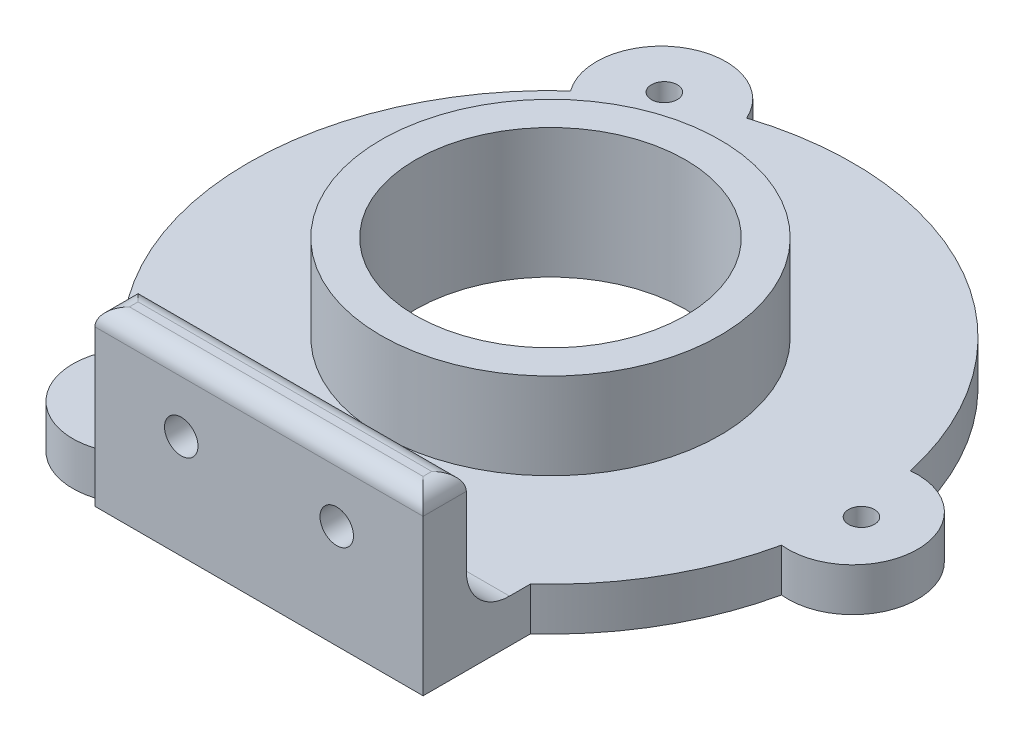
ISO-10303-21;
HEADER;
FILE_DESCRIPTION(('STEP AP214'),'2;1');
FILE_NAME('part.step','',(''),(''),'','','');
FILE_SCHEMA(('AUTOMOTIVE_DESIGN { 1 0 10303 214 1 1 1 1 }'));
ENDSEC;
DATA;
#1=APPLICATION_CONTEXT('core data for automotive mechanical design processes');
#2=APPLICATION_PROTOCOL_DEFINITION('international standard','automotive_design',2000,#1);
#3=PRODUCT_CONTEXT('',#1,'mechanical');
#4=PRODUCT('Part','Part','',(#3));
#5=PRODUCT_RELATED_PRODUCT_CATEGORY('part','',(#4));
#6=PRODUCT_DEFINITION_FORMATION('','',#4);
#7=PRODUCT_DEFINITION_CONTEXT('part definition',#1,'design');
#8=PRODUCT_DEFINITION('design','',#6,#7);
#9=PRODUCT_DEFINITION_SHAPE('','',#8);
#10=(LENGTH_UNIT() NAMED_UNIT(*) SI_UNIT(.MILLI.,.METRE.));
#11=(NAMED_UNIT(*) PLANE_ANGLE_UNIT() SI_UNIT($,.RADIAN.));
#12=(NAMED_UNIT(*) SI_UNIT($,.STERADIAN.) SOLID_ANGLE_UNIT());
#13=UNCERTAINTY_MEASURE_WITH_UNIT(LENGTH_MEASURE(1.E-05),#10,'distance_accuracy_value','');
#14=(GEOMETRIC_REPRESENTATION_CONTEXT(3) GLOBAL_UNCERTAINTY_ASSIGNED_CONTEXT((#13)) GLOBAL_UNIT_ASSIGNED_CONTEXT((#10,
#11,#12)) REPRESENTATION_CONTEXT('',''));
#15=CARTESIAN_POINT('',(0.,0.,0.));
#16=DIRECTION('',(0.,0.,1.));
#17=DIRECTION('',(1.,0.,0.));
#18=AXIS2_PLACEMENT_3D('',#15,#16,#17);
#19=CARTESIAN_POINT('',(0.,4.,0.));
#20=DIRECTION('',(0.,1.,0.));
#21=DIRECTION('',(0.,0.,1.));
#22=AXIS2_PLACEMENT_3D('',#19,#20,#21);
#23=PLANE('',#22);
#24=CARTESIAN_POINT('',(28.8,4.,0.));
#25=DIRECTION('',(0.,1.,0.));
#26=DIRECTION('',(0.,0.,1.));
#27=AXIS2_PLACEMENT_3D('',#24,#25,#26);
#28=CIRCLE('',#27,1.19737523071892);
#29=CARTESIAN_POINT('',(28.8,4.,1.19737523071892));
#30=VERTEX_POINT('',#29);
#31=EDGE_CURVE('E186',#30,#30,#28,.T.);
#32=ORIENTED_EDGE('',*,*,#31,.F.);
#33=EDGE_LOOP('',(#32));
#34=FACE_BOUND('',#33,.T.);
#35=CARTESIAN_POINT('',(-14.3999999999998,4.,-24.941531628992));
#36=DIRECTION('',(0.,1.,0.));
#37=DIRECTION('',(0.,0.,1.));
#38=AXIS2_PLACEMENT_3D('',#35,#36,#37);
#39=CIRCLE('',#38,1.19737523071892);
#40=CARTESIAN_POINT('',(-14.3999999999998,4.,-23.744156398273));
#41=VERTEX_POINT('',#40);
#42=EDGE_CURVE('E182',#41,#41,#39,.T.);
#43=ORIENTED_EDGE('',*,*,#42,.F.);
#44=EDGE_LOOP('',(#43));
#45=FACE_BOUND('',#44,.T.);
#46=CARTESIAN_POINT('',(-14.4000000000001,4.,24.9415316289918));
#47=DIRECTION('',(0.,1.,0.));
#48=DIRECTION('',(0.,0.,1.));
#49=AXIS2_PLACEMENT_3D('',#46,#47,#48);
#50=CIRCLE('',#49,1.19737523071892);
#51=CARTESIAN_POINT('',(-14.4000000000001,4.,26.1389068597107));
#52=VERTEX_POINT('',#51);
#53=EDGE_CURVE('E187',#52,#52,#50,.T.);
#54=ORIENTED_EDGE('',*,*,#53,.F.);
#55=EDGE_LOOP('',(#54));
#56=FACE_BOUND('',#55,.T.);
#57=CARTESIAN_POINT('',(0.,4.,0.));
#58=DIRECTION('',(0.,1.,0.));
#59=DIRECTION('',(0.,0.,1.));
#60=AXIS2_PLACEMENT_3D('',#57,#58,#59);
#61=CIRCLE('',#60,15.7);
#62=CARTESIAN_POINT('',(0.,4.,15.7));
#63=VERTEX_POINT('',#62);
#64=EDGE_CURVE('E173',#63,#63,#61,.T.);
#65=ORIENTED_EDGE('',*,*,#64,.F.);
#66=EDGE_LOOP('',(#65));
#67=FACE_BOUND('',#66,.T.);
#68=DIRECTION('',(0.,0.,1.));
#69=VECTOR('',#68,1.);
#70=CARTESIAN_POINT('',(-11.5500000000001,4.,30.6487113059642));
#71=LINE('',#70,#69);
#72=CARTESIAN_POINT('',(-11.5500000000001,4.,22.6487113059642));
#73=VERTEX_POINT('',#72);
#74=CARTESIAN_POINT('',(-11.5500000000001,4.,29.7257086585289));
#75=VERTEX_POINT('',#74);
#76=EDGE_CURVE('E272',#73,#75,#71,.T.);
#77=ORIENTED_EDGE('',*,*,#76,.F.);
#78=DIRECTION('',(-1.,0.,0.));
#79=VECTOR('',#78,1.);
#80=CARTESIAN_POINT('',(0.,4.,22.6487113059642));
#81=LINE('',#80,#79);
#82=CARTESIAN_POINT('',(18.8499999999999,4.,22.6487113059642));
#83=VERTEX_POINT('',#82);
#84=EDGE_CURVE('E242',#73,#83,#81,.F.);
#85=ORIENTED_EDGE('',*,*,#84,.T.);
#86=DIRECTION('',(0.,0.,-1.));
#87=VECTOR('',#86,1.);
#88=CARTESIAN_POINT('',(18.8499999999999,4.,20.2487113059642));
#89=LINE('',#88,#87);
#90=CARTESIAN_POINT('',(18.8499999999999,4.,20.7045284901638));
#91=VERTEX_POINT('',#90);
#92=EDGE_CURVE('E144',#83,#91,#89,.T.);
#93=ORIENTED_EDGE('',*,*,#92,.T.);
#94=CARTESIAN_POINT('',(0.,4.,0.));
#95=DIRECTION('',(0.,1.,0.));
#96=DIRECTION('',(0.,0.,1.));
#97=AXIS2_PLACEMENT_3D('',#94,#95,#96);
#98=CIRCLE('',#97,28.);
#99=CARTESIAN_POINT('',(27.3571428571429,4.,5.96546181731788));
#100=VERTEX_POINT('',#99);
#101=EDGE_CURVE('E233',#91,#100,#98,.T.);
#102=ORIENTED_EDGE('',*,*,#101,.T.);
#103=CARTESIAN_POINT('',(28.,4.,0.));
#104=DIRECTION('',(0.,1.,0.));
#105=DIRECTION('',(0.,0.,1.));
#106=AXIS2_PLACEMENT_3D('',#103,#104,#105);
#107=CIRCLE('',#106,6.);
#108=CARTESIAN_POINT('',(27.3571428571429,4.,-5.96546181731788));
#109=VERTEX_POINT('',#108);
#110=EDGE_CURVE('E218',#100,#109,#107,.T.);
#111=ORIENTED_EDGE('',*,*,#110,.T.);
#112=CARTESIAN_POINT('',(-8.51232994946781,4.,-26.6747115979047));
#113=VERTEX_POINT('',#112);
#114=EDGE_CURVE('E229',#109,#113,#98,.T.);
#115=ORIENTED_EDGE('',*,*,#114,.T.);
#116=CARTESIAN_POINT('',(-13.9999999999998,4.,-24.2487113059644));
#117=DIRECTION('',(0.,1.,0.));
#118=DIRECTION('',(0.,0.,1.));
#119=AXIS2_PLACEMENT_3D('',#116,#117,#118);
#120=CIRCLE('',#119,6.);
#121=CARTESIAN_POINT('',(-18.8448129076746,4.,-20.709249780587));
#122=VERTEX_POINT('',#121);
#123=EDGE_CURVE('E198',#113,#122,#120,.T.);
#124=ORIENTED_EDGE('',*,*,#123,.T.);
#125=CARTESIAN_POINT('',(-18.8448129076749,4.,20.7092497805867));
#126=VERTEX_POINT('',#125);
#127=EDGE_CURVE('E232',#122,#126,#98,.T.);
#128=ORIENTED_EDGE('',*,*,#127,.T.);
#129=CARTESIAN_POINT('',(-14.0000000000001,4.,24.2487113059642));
#130=DIRECTION('',(0.,1.,0.));
#131=DIRECTION('',(0.,0.,1.));
#132=AXIS2_PLACEMENT_3D('',#129,#130,#131);
#133=CIRCLE('',#132,6.);
#134=EDGE_CURVE('E210',#126,#75,#133,.T.);
#135=ORIENTED_EDGE('',*,*,#134,.T.);
#136=EDGE_LOOP('',(#77,#85,#93,#102,#111,#115,#124,#128,#135));
#137=FACE_BOUND('',#136,.T.);
#138=ADVANCED_FACE('F33',(#34,#45,#56,#67,#137),#23,.T.);
#139=CARTESIAN_POINT('',(0.,4.,0.));
#140=DIRECTION('',(0.,-1.,0.));
#141=DIRECTION('',(0.,0.,-1.));
#142=AXIS2_PLACEMENT_3D('',#139,#140,#141);
#143=CYLINDRICAL_SURFACE('',#142,28.);
#144=CARTESIAN_POINT('',(0.,0.,0.));
#145=DIRECTION('',(0.,1.,0.));
#146=DIRECTION('',(0.,0.,1.));
#147=AXIS2_PLACEMENT_3D('',#144,#145,#146);
#148=CIRCLE('',#147,28.);
#149=CARTESIAN_POINT('',(27.3571428571429,0.,-5.96546181731788));
#150=VERTEX_POINT('',#149);
#151=CARTESIAN_POINT('',(-8.51232994946781,0.,-26.6747115979047));
#152=VERTEX_POINT('',#151);
#153=EDGE_CURVE('E234',#150,#152,#148,.T.);
#154=ORIENTED_EDGE('',*,*,#153,.T.);
#155=DIRECTION('',(0.,1.,0.));
#156=VECTOR('',#155,1.);
#157=CARTESIAN_POINT('',(-8.51232994946781,2.,-26.6747115979047));
#158=LINE('',#157,#156);
#159=EDGE_CURVE('E207',#152,#113,#158,.T.);
#160=ORIENTED_EDGE('',*,*,#159,.T.);
#161=ORIENTED_EDGE('',*,*,#114,.F.);
#162=DIRECTION('',(0.,1.,0.));
#163=VECTOR('',#162,1.);
#164=CARTESIAN_POINT('',(27.3571428571429,2.,-5.96546181731788));
#165=LINE('',#164,#163);
#166=EDGE_CURVE('E221',#109,#150,#165,.F.);
#167=ORIENTED_EDGE('',*,*,#166,.T.);
#168=EDGE_LOOP('',(#154,#160,#161,#167));
#169=FACE_BOUND('',#168,.T.);
#170=ADVANCED_FACE('F328',(#169),#143,.T.);
#171=ORIENTED_EDGE('',*,*,#127,.F.);
#172=DIRECTION('',(0.,1.,0.));
#173=VECTOR('',#172,1.);
#174=CARTESIAN_POINT('',(-18.8448129076746,2.,-20.709249780587));
#175=LINE('',#174,#173);
#176=CARTESIAN_POINT('',(-18.8448129076746,0.,-20.709249780587));
#177=VERTEX_POINT('',#176);
#178=EDGE_CURVE('E203',#122,#177,#175,.F.);
#179=ORIENTED_EDGE('',*,*,#178,.T.);
#180=CARTESIAN_POINT('',(-18.8448129076749,0.,20.7092497805867));
#181=VERTEX_POINT('',#180);
#182=EDGE_CURVE('E237',#177,#181,#148,.T.);
#183=ORIENTED_EDGE('',*,*,#182,.T.);
#184=DIRECTION('',(0.,1.,0.));
#185=VECTOR('',#184,1.);
#186=CARTESIAN_POINT('',(-18.8448129076749,2.,20.7092497805867));
#187=LINE('',#186,#185);
#188=EDGE_CURVE('E213',#181,#126,#187,.T.);
#189=ORIENTED_EDGE('',*,*,#188,.T.);
#190=EDGE_LOOP('',(#171,#179,#183,#189));
#191=FACE_BOUND('',#190,.T.);
#192=ADVANCED_FACE('F336',(#191),#143,.T.);
#193=ORIENTED_EDGE('',*,*,#101,.F.);
#194=DIRECTION('',(0.,-1.,0.));
#195=VECTOR('',#194,1.);
#196=CARTESIAN_POINT('',(18.8499999999999,4.,20.7045284901638));
#197=LINE('',#196,#195);
#198=CARTESIAN_POINT('',(18.8499999999999,0.,20.7045284901638));
#199=VERTEX_POINT('',#198);
#200=EDGE_CURVE('E166',#91,#199,#197,.T.);
#201=ORIENTED_EDGE('',*,*,#200,.T.);
#202=CARTESIAN_POINT('',(27.3571428571429,0.,5.96546181731788));
#203=VERTEX_POINT('',#202);
#204=EDGE_CURVE('E228',#199,#203,#148,.T.);
#205=ORIENTED_EDGE('',*,*,#204,.T.);
#206=DIRECTION('',(0.,1.,0.));
#207=VECTOR('',#206,1.);
#208=CARTESIAN_POINT('',(27.3571428571429,2.,5.96546181731788));
#209=LINE('',#208,#207);
#210=EDGE_CURVE('E225',#203,#100,#209,.T.);
#211=ORIENTED_EDGE('',*,*,#210,.T.);
#212=EDGE_LOOP('',(#193,#201,#205,#211));
#213=FACE_BOUND('',#212,.T.);
#214=ADVANCED_FACE('F339',(#213),#143,.T.);
#215=CARTESIAN_POINT('',(0.,0.,0.));
#216=DIRECTION('',(0.,1.,0.));
#217=DIRECTION('',(0.,0.,1.));
#218=AXIS2_PLACEMENT_3D('',#215,#216,#217);
#219=PLANE('',#218);
#220=ORIENTED_EDGE('',*,*,#204,.F.);
#221=DIRECTION('',(0.,0.,-1.));
#222=VECTOR('',#221,1.);
#223=CARTESIAN_POINT('',(18.8499999999999,0.,20.2487113059642));
#224=LINE('',#223,#222);
#225=CARTESIAN_POINT('',(18.8499999999999,0.,30.6487113059642));
#226=VERTEX_POINT('',#225);
#227=EDGE_CURVE('E154',#226,#199,#224,.T.);
#228=ORIENTED_EDGE('',*,*,#227,.F.);
#229=DIRECTION('',(1.,0.,0.));
#230=VECTOR('',#229,1.);
#231=CARTESIAN_POINT('',(-11.5500000000001,0.,30.6487113059642));
#232=LINE('',#231,#230);
#233=CARTESIAN_POINT('',(-11.5500000000001,0.,30.6487113059642));
#234=VERTEX_POINT('',#233);
#235=EDGE_CURVE('E143',#234,#226,#232,.T.);
#236=ORIENTED_EDGE('',*,*,#235,.F.);
#237=DIRECTION('',(0.,0.,1.));
#238=VECTOR('',#237,1.);
#239=CARTESIAN_POINT('',(-11.5500000000001,0.,20.2487113059642));
#240=LINE('',#239,#238);
#241=CARTESIAN_POINT('',(-11.5500000000001,0.,29.7257086585289));
#242=VERTEX_POINT('',#241);
#243=EDGE_CURVE('E133',#242,#234,#240,.T.);
#244=ORIENTED_EDGE('',*,*,#243,.F.);
#245=CARTESIAN_POINT('',(-14.0000000000001,0.,24.2487113059642));
#246=DIRECTION('',(0.,1.,0.));
#247=DIRECTION('',(0.,0.,1.));
#248=AXIS2_PLACEMENT_3D('',#245,#246,#247);
#249=CIRCLE('',#248,6.);
#250=EDGE_CURVE('E211',#181,#242,#249,.T.);
#251=ORIENTED_EDGE('',*,*,#250,.F.);
#252=ORIENTED_EDGE('',*,*,#182,.F.);
#253=CARTESIAN_POINT('',(-13.9999999999998,0.,-24.2487113059644));
#254=DIRECTION('',(0.,1.,0.));
#255=DIRECTION('',(0.,0.,1.));
#256=AXIS2_PLACEMENT_3D('',#253,#254,#255);
#257=CIRCLE('',#256,6.);
#258=EDGE_CURVE('E201',#152,#177,#257,.T.);
#259=ORIENTED_EDGE('',*,*,#258,.F.);
#260=ORIENTED_EDGE('',*,*,#153,.F.);
#261=CARTESIAN_POINT('',(28.,0.,0.));
#262=DIRECTION('',(0.,1.,0.));
#263=DIRECTION('',(0.,0.,1.));
#264=AXIS2_PLACEMENT_3D('',#261,#262,#263);
#265=CIRCLE('',#264,6.);
#266=EDGE_CURVE('E219',#203,#150,#265,.T.);
#267=ORIENTED_EDGE('',*,*,#266,.F.);
#268=EDGE_LOOP('',(#220,#228,#236,#244,#251,#252,#259,#260,#267));
#269=FACE_BOUND('',#268,.T.);
#270=CARTESIAN_POINT('',(0.,0.,0.));
#271=DIRECTION('',(0.,1.,0.));
#272=DIRECTION('',(0.,0.,1.));
#273=AXIS2_PLACEMENT_3D('',#270,#271,#272);
#274=CIRCLE('',#273,12.5);
#275=CARTESIAN_POINT('',(0.,0.,12.5));
#276=VERTEX_POINT('',#275);
#277=EDGE_CURVE('E177',#276,#276,#274,.T.);
#278=ORIENTED_EDGE('',*,*,#277,.T.);
#279=EDGE_LOOP('',(#278));
#280=FACE_BOUND('',#279,.T.);
#281=CARTESIAN_POINT('',(-14.4000000000001,0.,24.9415316289918));
#282=DIRECTION('',(0.,1.,0.));
#283=DIRECTION('',(0.,0.,1.));
#284=AXIS2_PLACEMENT_3D('',#281,#282,#283);
#285=CIRCLE('',#284,1.19737523071892);
#286=CARTESIAN_POINT('',(-14.4000000000001,0.,26.1389068597107));
#287=VERTEX_POINT('',#286);
#288=EDGE_CURVE('E183',#287,#287,#285,.T.);
#289=ORIENTED_EDGE('',*,*,#288,.T.);
#290=EDGE_LOOP('',(#289));
#291=FACE_BOUND('',#290,.T.);
#292=CARTESIAN_POINT('',(-14.3999999999998,0.,-24.941531628992));
#293=DIRECTION('',(0.,1.,0.));
#294=DIRECTION('',(0.,0.,1.));
#295=AXIS2_PLACEMENT_3D('',#292,#293,#294);
#296=CIRCLE('',#295,1.19737523071892);
#297=CARTESIAN_POINT('',(-14.3999999999998,0.,-23.744156398273));
#298=VERTEX_POINT('',#297);
#299=EDGE_CURVE('E190',#298,#298,#296,.T.);
#300=ORIENTED_EDGE('',*,*,#299,.T.);
#301=EDGE_LOOP('',(#300));
#302=FACE_BOUND('',#301,.T.);
#303=CARTESIAN_POINT('',(28.8,0.,0.));
#304=DIRECTION('',(0.,1.,0.));
#305=DIRECTION('',(0.,0.,1.));
#306=AXIS2_PLACEMENT_3D('',#303,#304,#305);
#307=CIRCLE('',#306,1.19737523071892);
#308=CARTESIAN_POINT('',(28.8,0.,1.19737523071892));
#309=VERTEX_POINT('',#308);
#310=EDGE_CURVE('E195',#309,#309,#307,.T.);
#311=ORIENTED_EDGE('',*,*,#310,.T.);
#312=EDGE_LOOP('',(#311));
#313=FACE_BOUND('',#312,.T.);
#314=ADVANCED_FACE('F158',(#269,#280,#291,#302,#313),#219,.F.);
#315=CARTESIAN_POINT('',(28.,0.,0.));
#316=DIRECTION('',(0.,1.,0.));
#317=DIRECTION('',(0.,0.,1.));
#318=AXIS2_PLACEMENT_3D('',#315,#316,#317);
#319=CYLINDRICAL_SURFACE('',#318,6.);
#320=ORIENTED_EDGE('',*,*,#210,.F.);
#321=ORIENTED_EDGE('',*,*,#266,.T.);
#322=ORIENTED_EDGE('',*,*,#166,.F.);
#323=ORIENTED_EDGE('',*,*,#110,.F.);
#324=EDGE_LOOP('',(#320,#321,#322,#323));
#325=FACE_BOUND('',#324,.T.);
#326=ADVANCED_FACE('F344',(#325),#319,.T.);
#327=CARTESIAN_POINT('',(-14.0000000000001,0.,24.2487113059642));
#328=DIRECTION('',(0.,1.,0.));
#329=DIRECTION('',(0.,0.,1.));
#330=AXIS2_PLACEMENT_3D('',#327,#328,#329);
#331=CYLINDRICAL_SURFACE('',#330,6.);
#332=DIRECTION('',(0.,1.,0.));
#333=VECTOR('',#332,1.);
#334=CARTESIAN_POINT('',(-11.5500000000001,0.,29.7257086585289));
#335=LINE('',#334,#333);
#336=EDGE_CURVE('E138',#75,#242,#335,.F.);
#337=ORIENTED_EDGE('',*,*,#336,.F.);
#338=ORIENTED_EDGE('',*,*,#134,.F.);
#339=ORIENTED_EDGE('',*,*,#188,.F.);
#340=ORIENTED_EDGE('',*,*,#250,.T.);
#341=EDGE_LOOP('',(#337,#338,#339,#340));
#342=FACE_BOUND('',#341,.T.);
#343=ADVANCED_FACE('F394',(#342),#331,.T.);
#344=CARTESIAN_POINT('',(-13.9999999999998,0.,-24.2487113059644));
#345=DIRECTION('',(0.,1.,0.));
#346=DIRECTION('',(0.,0.,1.));
#347=AXIS2_PLACEMENT_3D('',#344,#345,#346);
#348=CYLINDRICAL_SURFACE('',#347,6.);
#349=ORIENTED_EDGE('',*,*,#159,.F.);
#350=ORIENTED_EDGE('',*,*,#258,.T.);
#351=ORIENTED_EDGE('',*,*,#178,.F.);
#352=ORIENTED_EDGE('',*,*,#123,.F.);
#353=EDGE_LOOP('',(#349,#350,#351,#352));
#354=FACE_BOUND('',#353,.T.);
#355=ADVANCED_FACE('F391',(#354),#348,.T.);
#356=CARTESIAN_POINT('',(28.8,0.,0.));
#357=DIRECTION('',(0.,1.,0.));
#358=DIRECTION('',(0.,0.,1.));
#359=AXIS2_PLACEMENT_3D('',#356,#357,#358);
#360=CYLINDRICAL_SURFACE('',#359,1.19737523071892);
#361=ORIENTED_EDGE('',*,*,#310,.F.);
#362=EDGE_LOOP('',(#361));
#363=FACE_BOUND('',#362,.T.);
#364=ORIENTED_EDGE('',*,*,#31,.T.);
#365=EDGE_LOOP('',(#364));
#366=FACE_BOUND('',#365,.T.);
#367=ADVANCED_FACE('F387',(#363,#366),#360,.F.);
#368=CARTESIAN_POINT('',(-14.3999999999998,0.,-24.941531628992));
#369=DIRECTION('',(0.,1.,0.));
#370=DIRECTION('',(0.,0.,1.));
#371=AXIS2_PLACEMENT_3D('',#368,#369,#370);
#372=CYLINDRICAL_SURFACE('',#371,1.19737523071892);
#373=ORIENTED_EDGE('',*,*,#299,.F.);
#374=EDGE_LOOP('',(#373));
#375=FACE_BOUND('',#374,.T.);
#376=ORIENTED_EDGE('',*,*,#42,.T.);
#377=EDGE_LOOP('',(#376));
#378=FACE_BOUND('',#377,.T.);
#379=ADVANCED_FACE('F383',(#375,#378),#372,.F.);
#380=CARTESIAN_POINT('',(-14.4000000000001,0.,24.9415316289918));
#381=DIRECTION('',(0.,1.,0.));
#382=DIRECTION('',(0.,0.,1.));
#383=AXIS2_PLACEMENT_3D('',#380,#381,#382);
#384=CYLINDRICAL_SURFACE('',#383,1.19737523071892);
#385=ORIENTED_EDGE('',*,*,#288,.F.);
#386=EDGE_LOOP('',(#385));
#387=FACE_BOUND('',#386,.T.);
#388=ORIENTED_EDGE('',*,*,#53,.T.);
#389=EDGE_LOOP('',(#388));
#390=FACE_BOUND('',#389,.T.);
#391=ADVANCED_FACE('F379',(#387,#390),#384,.F.);
#392=CARTESIAN_POINT('',(0.,0.,0.));
#393=DIRECTION('',(0.,1.,0.));
#394=DIRECTION('',(0.,0.,1.));
#395=AXIS2_PLACEMENT_3D('',#392,#393,#394);
#396=CYLINDRICAL_SURFACE('',#395,12.5);
#397=ORIENTED_EDGE('',*,*,#277,.F.);
#398=EDGE_LOOP('',(#397));
#399=FACE_BOUND('',#398,.T.);
#400=CARTESIAN_POINT('',(0.,12.,0.));
#401=DIRECTION('',(0.,1.,0.));
#402=DIRECTION('',(0.,0.,1.));
#403=AXIS2_PLACEMENT_3D('',#400,#401,#402);
#404=CIRCLE('',#403,12.5);
#405=CARTESIAN_POINT('',(0.,12.,12.5));
#406=VERTEX_POINT('',#405);
#407=EDGE_CURVE('E170',#406,#406,#404,.T.);
#408=ORIENTED_EDGE('',*,*,#407,.T.);
#409=EDGE_LOOP('',(#408));
#410=FACE_BOUND('',#409,.T.);
#411=ADVANCED_FACE('F373',(#399,#410),#396,.F.);
#412=CARTESIAN_POINT('',(0.,12.,0.));
#413=DIRECTION('',(0.,1.,0.));
#414=DIRECTION('',(0.,0.,1.));
#415=AXIS2_PLACEMENT_3D('',#412,#413,#414);
#416=PLANE('',#415);
#417=CARTESIAN_POINT('',(0.,12.,0.));
#418=DIRECTION('',(0.,1.,0.));
#419=DIRECTION('',(0.,0.,1.));
#420=AXIS2_PLACEMENT_3D('',#417,#418,#419);
#421=CIRCLE('',#420,15.7);
#422=CARTESIAN_POINT('',(0.,12.,15.7));
#423=VERTEX_POINT('',#422);
#424=EDGE_CURVE('E174',#423,#423,#421,.T.);
#425=ORIENTED_EDGE('',*,*,#424,.T.);
#426=EDGE_LOOP('',(#425));
#427=FACE_BOUND('',#426,.T.);
#428=ORIENTED_EDGE('',*,*,#407,.F.);
#429=EDGE_LOOP('',(#428));
#430=FACE_BOUND('',#429,.T.);
#431=ADVANCED_FACE('F370',(#427,#430),#416,.T.);
#432=CARTESIAN_POINT('',(0.,12.,0.));
#433=DIRECTION('',(0.,-1.,0.));
#434=DIRECTION('',(0.,0.,-1.));
#435=AXIS2_PLACEMENT_3D('',#432,#433,#434);
#436=CYLINDRICAL_SURFACE('',#435,15.7);
#437=ORIENTED_EDGE('',*,*,#424,.F.);
#438=EDGE_LOOP('',(#437));
#439=FACE_BOUND('',#438,.T.);
#440=ORIENTED_EDGE('',*,*,#64,.T.);
#441=EDGE_LOOP('',(#440));
#442=FACE_BOUND('',#441,.T.);
#443=ADVANCED_FACE('F365',(#439,#442),#436,.T.);
#444=CARTESIAN_POINT('',(18.8499999999999,0.,20.2487113059642));
#445=DIRECTION('',(1.,0.,0.));
#446=DIRECTION('',(0.,0.,-1.));
#447=AXIS2_PLACEMENT_3D('',#444,#445,#446);
#448=PLANE('',#447);
#449=DIRECTION('',(0.,-1.,0.));
#450=VECTOR('',#449,1.);
#451=CARTESIAN_POINT('',(18.8499999999999,16.,26.6487113059642));
#452=LINE('',#451,#450);
#453=CARTESIAN_POINT('',(18.8499999999999,14.4,26.6487113059642));
#454=VERTEX_POINT('',#453);
#455=CARTESIAN_POINT('',(18.8499999999999,8.,26.6487113059642));
#456=VERTEX_POINT('',#455);
#457=EDGE_CURVE('E165',#454,#456,#452,.T.);
#458=ORIENTED_EDGE('',*,*,#457,.F.);
#459=DIRECTION('',(0.,0.,-1.));
#460=VECTOR('',#459,1.);
#461=CARTESIAN_POINT('',(18.8499999999999,14.4,20.2487113059642));
#462=LINE('',#461,#460);
#463=CARTESIAN_POINT('',(18.8499999999999,14.4,30.6487113059642));
#464=VERTEX_POINT('',#463);
#465=EDGE_CURVE('E11',#454,#464,#462,.F.);
#466=ORIENTED_EDGE('',*,*,#465,.T.);
#467=DIRECTION('',(0.,1.,0.));
#468=VECTOR('',#467,1.);
#469=CARTESIAN_POINT('',(18.8499999999999,0.,30.6487113059642));
#470=LINE('',#469,#468);
#471=EDGE_CURVE('E153',#226,#464,#470,.T.);
#472=ORIENTED_EDGE('',*,*,#471,.F.);
#473=ORIENTED_EDGE('',*,*,#227,.T.);
#474=ORIENTED_EDGE('',*,*,#200,.F.);
#475=ORIENTED_EDGE('',*,*,#92,.F.);
#476=CARTESIAN_POINT('',(18.8499999999999,8.,22.6487113059642));
#477=DIRECTION('',(1.,0.,0.));
#478=DIRECTION('',(0.,0.,-1.));
#479=AXIS2_PLACEMENT_3D('',#476,#477,#478);
#480=CIRCLE('',#479,4.);
#481=EDGE_CURVE('E247',#83,#456,#480,.F.);
#482=ORIENTED_EDGE('',*,*,#481,.T.);
#483=EDGE_LOOP('',(#458,#466,#472,#473,#474,#475,#482));
#484=FACE_BOUND('',#483,.T.);
#485=ADVANCED_FACE('F293',(#484),#448,.T.);
#486=CARTESIAN_POINT('',(-11.5500000000001,0.,20.2487113059642));
#487=DIRECTION('',(-1.,0.,0.));
#488=DIRECTION('',(0.,0.,1.));
#489=AXIS2_PLACEMENT_3D('',#486,#487,#488);
#490=PLANE('',#489);
#491=DIRECTION('',(0.,1.,0.));
#492=VECTOR('',#491,1.);
#493=CARTESIAN_POINT('',(-11.5500000000001,0.,30.6487113059642));
#494=LINE('',#493,#492);
#495=CARTESIAN_POINT('',(-11.5500000000001,14.4,30.6487113059642));
#496=VERTEX_POINT('',#495);
#497=EDGE_CURVE('E136',#234,#496,#494,.T.);
#498=ORIENTED_EDGE('',*,*,#497,.T.);
#499=DIRECTION('',(0.,0.,1.));
#500=VECTOR('',#499,1.);
#501=CARTESIAN_POINT('',(-11.5500000000001,14.4,20.2487113059642));
#502=LINE('',#501,#500);
#503=CARTESIAN_POINT('',(-11.5500000000001,14.4,26.6487113059642));
#504=VERTEX_POINT('',#503);
#505=EDGE_CURVE('E57',#496,#504,#502,.F.);
#506=ORIENTED_EDGE('',*,*,#505,.T.);
#507=DIRECTION('',(0.,-1.,0.));
#508=VECTOR('',#507,1.);
#509=CARTESIAN_POINT('',(-11.5500000000001,16.,26.6487113059642));
#510=LINE('',#509,#508);
#511=CARTESIAN_POINT('',(-11.5500000000001,8.,26.6487113059642));
#512=VERTEX_POINT('',#511);
#513=EDGE_CURVE('E286',#504,#512,#510,.T.);
#514=ORIENTED_EDGE('',*,*,#513,.T.);
#515=CARTESIAN_POINT('',(-11.5500000000001,8.,22.6487113059642));
#516=DIRECTION('',(-1.,0.,0.));
#517=DIRECTION('',(0.,0.,1.));
#518=AXIS2_PLACEMENT_3D('',#515,#516,#517);
#519=CIRCLE('',#518,4.);
#520=EDGE_CURVE('E244',#512,#73,#519,.F.);
#521=ORIENTED_EDGE('',*,*,#520,.T.);
#522=ORIENTED_EDGE('',*,*,#76,.T.);
#523=ORIENTED_EDGE('',*,*,#336,.T.);
#524=ORIENTED_EDGE('',*,*,#243,.T.);
#525=EDGE_LOOP('',(#498,#506,#514,#521,#522,#523,#524));
#526=FACE_BOUND('',#525,.T.);
#527=ADVANCED_FACE('F135',(#526),#490,.T.);
#528=CARTESIAN_POINT('',(-11.5500000000001,0.,30.6487113059642));
#529=DIRECTION('',(0.,0.,1.));
#530=DIRECTION('',(1.,0.,0.));
#531=AXIS2_PLACEMENT_3D('',#528,#529,#530);
#532=PLANE('',#531);
#533=CARTESIAN_POINT('',(10.8499999999999,9.6,30.6487113059642));
#534=DIRECTION('',(0.,0.,1.));
#535=DIRECTION('',(1.,0.,0.));
#536=AXIS2_PLACEMENT_3D('',#533,#534,#535);
#537=CIRCLE('',#536,1.55);
#538=CARTESIAN_POINT('',(12.3999999999999,9.6,30.6487113059642));
#539=VERTEX_POINT('',#538);
#540=EDGE_CURVE('E282',#539,#539,#537,.T.);
#541=ORIENTED_EDGE('',*,*,#540,.F.);
#542=EDGE_LOOP('',(#541));
#543=FACE_BOUND('',#542,.T.);
#544=CARTESIAN_POINT('',(-3.55000000000011,9.6,30.6487113059642));
#545=DIRECTION('',(0.,0.,1.));
#546=DIRECTION('',(1.,0.,0.));
#547=AXIS2_PLACEMENT_3D('',#544,#545,#546);
#548=CIRCLE('',#547,1.55);
#549=CARTESIAN_POINT('',(-2.00000000000011,9.6,30.6487113059642));
#550=VERTEX_POINT('',#549);
#551=EDGE_CURVE('E274',#550,#550,#548,.T.);
#552=ORIENTED_EDGE('',*,*,#551,.F.);
#553=EDGE_LOOP('',(#552));
#554=FACE_BOUND('',#553,.T.);
#555=ORIENTED_EDGE('',*,*,#471,.T.);
#556=DIRECTION('',(1.,0.,0.));
#557=VECTOR('',#556,1.);
#558=CARTESIAN_POINT('',(-11.5500000000001,14.4,30.6487113059642));
#559=LINE('',#558,#557);
#560=EDGE_CURVE('E152',#464,#496,#559,.F.);
#561=ORIENTED_EDGE('',*,*,#560,.T.);
#562=ORIENTED_EDGE('',*,*,#497,.F.);
#563=ORIENTED_EDGE('',*,*,#235,.T.);
#564=EDGE_LOOP('',(#555,#561,#562,#563));
#565=FACE_BOUND('',#564,.T.);
#566=ADVANCED_FACE('F150',(#543,#554,#565),#532,.T.);
#567=CARTESIAN_POINT('',(18.8499999999999,16.,26.6487113059642));
#568=DIRECTION('',(0.,0.,1.));
#569=DIRECTION('',(1.,0.,0.));
#570=AXIS2_PLACEMENT_3D('',#567,#568,#569);
#571=PLANE('',#570);
#572=CARTESIAN_POINT('',(10.8499999999999,9.6,26.6487113059642));
#573=DIRECTION('',(0.,0.,1.));
#574=DIRECTION('',(1.,0.,0.));
#575=AXIS2_PLACEMENT_3D('',#572,#573,#574);
#576=CIRCLE('',#575,1.55);
#577=CARTESIAN_POINT('',(12.3999999999999,9.6,26.6487113059642));
#578=VERTEX_POINT('',#577);
#579=EDGE_CURVE('E37',#578,#578,#576,.T.);
#580=ORIENTED_EDGE('',*,*,#579,.T.);
#581=EDGE_LOOP('',(#580));
#582=FACE_BOUND('',#581,.T.);
#583=CARTESIAN_POINT('',(-3.55000000000011,9.6,26.6487113059642));
#584=DIRECTION('',(0.,0.,1.));
#585=DIRECTION('',(1.,0.,0.));
#586=AXIS2_PLACEMENT_3D('',#583,#584,#585);
#587=CIRCLE('',#586,1.55);
#588=CARTESIAN_POINT('',(-2.00000000000011,9.6,26.6487113059642));
#589=VERTEX_POINT('',#588);
#590=EDGE_CURVE('E265',#589,#589,#587,.T.);
#591=ORIENTED_EDGE('',*,*,#590,.T.);
#592=EDGE_LOOP('',(#591));
#593=FACE_BOUND('',#592,.T.);
#594=ORIENTED_EDGE('',*,*,#513,.F.);
#595=DIRECTION('',(-1.,0.,0.));
#596=VECTOR('',#595,1.);
#597=CARTESIAN_POINT('',(18.8499999999999,14.4,26.6487113059642));
#598=LINE('',#597,#596);
#599=EDGE_CURVE('E42',#504,#454,#598,.F.);
#600=ORIENTED_EDGE('',*,*,#599,.T.);
#601=ORIENTED_EDGE('',*,*,#457,.T.);
#602=DIRECTION('',(-1.,0.,0.));
#603=VECTOR('',#602,1.);
#604=CARTESIAN_POINT('',(18.8499999999999,8.,26.6487113059642));
#605=LINE('',#604,#603);
#606=EDGE_CURVE('E239',#456,#512,#605,.T.);
#607=ORIENTED_EDGE('',*,*,#606,.T.);
#608=EDGE_LOOP('',(#594,#600,#601,#607));
#609=FACE_BOUND('',#608,.T.);
#610=ADVANCED_FACE('F287',(#582,#593,#609),#571,.F.);
#611=CARTESIAN_POINT('',(0.,16.,0.));
#612=DIRECTION('',(0.,1.,0.));
#613=DIRECTION('',(0.,0.,1.));
#614=AXIS2_PLACEMENT_3D('',#611,#612,#613);
#615=PLANE('',#614);
#616=DIRECTION('',(0.,0.,1.));
#617=VECTOR('',#616,1.);
#618=CARTESIAN_POINT('',(-9.95000000000011,16.,0.));
#619=LINE('',#618,#617);
#620=CARTESIAN_POINT('',(-9.95000000000011,16.,28.2487113059642));
#621=VERTEX_POINT('',#620);
#622=CARTESIAN_POINT('',(-9.95000000000011,16.,29.0487113059642));
#623=VERTEX_POINT('',#622);
#624=EDGE_CURVE('E254',#621,#623,#619,.T.);
#625=ORIENTED_EDGE('',*,*,#624,.T.);
#626=DIRECTION('',(1.,0.,0.));
#627=VECTOR('',#626,1.);
#628=CARTESIAN_POINT('',(0.,16.,29.0487113059642));
#629=LINE('',#628,#627);
#630=CARTESIAN_POINT('',(17.2499999999999,16.,29.0487113059642));
#631=VERTEX_POINT('',#630);
#632=EDGE_CURVE('E256',#623,#631,#629,.T.);
#633=ORIENTED_EDGE('',*,*,#632,.T.);
#634=DIRECTION('',(0.,0.,-1.));
#635=VECTOR('',#634,1.);
#636=CARTESIAN_POINT('',(17.2499999999999,16.,0.));
#637=LINE('',#636,#635);
#638=CARTESIAN_POINT('',(17.2499999999999,16.,28.2487113059642));
#639=VERTEX_POINT('',#638);
#640=EDGE_CURVE('E250',#631,#639,#637,.T.);
#641=ORIENTED_EDGE('',*,*,#640,.T.);
#642=DIRECTION('',(-1.,0.,0.));
#643=VECTOR('',#642,1.);
#644=CARTESIAN_POINT('',(-11.5500000000001,16.,28.2487113059642));
#645=LINE('',#644,#643);
#646=EDGE_CURVE('E252',#639,#621,#645,.T.);
#647=ORIENTED_EDGE('',*,*,#646,.T.);
#648=EDGE_LOOP('',(#625,#633,#641,#647));
#649=FACE_BOUND('',#648,.T.);
#650=ADVANCED_FACE('F309',(#649),#615,.T.);
#651=CARTESIAN_POINT('',(18.8499999999999,8.,22.6487113059642));
#652=DIRECTION('',(-1.,0.,0.));
#653=DIRECTION('',(0.,0.,1.));
#654=AXIS2_PLACEMENT_3D('',#651,#652,#653);
#655=CYLINDRICAL_SURFACE('',#654,4.);
#656=ORIENTED_EDGE('',*,*,#481,.F.);
#657=ORIENTED_EDGE('',*,*,#84,.F.);
#658=ORIENTED_EDGE('',*,*,#520,.F.);
#659=ORIENTED_EDGE('',*,*,#606,.F.);
#660=EDGE_LOOP('',(#656,#657,#658,#659));
#661=FACE_BOUND('',#660,.T.);
#662=ADVANCED_FACE('F298',(#661),#655,.F.);
#663=CARTESIAN_POINT('',(0.,14.4,28.2487113059642));
#664=DIRECTION('',(1.,0.,0.));
#665=DIRECTION('',(0.,0.,-1.));
#666=AXIS2_PLACEMENT_3D('',#663,#664,#665);
#667=CYLINDRICAL_SURFACE('',#666,1.6);
#668=CARTESIAN_POINT('',(17.2499999999999,14.4,28.2487113059642));
#669=DIRECTION('',(-0.707106781186548,0.,-0.707106781186547));
#670=DIRECTION('',(0.707106781186547,0.,-0.707106781186548));
#671=AXIS2_PLACEMENT_3D('',#668,#669,#670);
#672=ELLIPSE('',#671,2.26274169979695,1.6);
#673=EDGE_CURVE('E267',#454,#639,#672,.F.);
#674=ORIENTED_EDGE('',*,*,#673,.F.);
#675=ORIENTED_EDGE('',*,*,#599,.F.);
#676=CARTESIAN_POINT('',(-9.95000000000011,14.4,28.2487113059642));
#677=DIRECTION('',(0.707106781186547,0.,-0.707106781186548));
#678=DIRECTION('',(0.707106781186548,0.,0.707106781186547));
#679=AXIS2_PLACEMENT_3D('',#676,#677,#678);
#680=ELLIPSE('',#679,2.26274169979695,1.6);
#681=EDGE_CURVE('E270',#621,#504,#680,.F.);
#682=ORIENTED_EDGE('',*,*,#681,.F.);
#683=ORIENTED_EDGE('',*,*,#646,.F.);
#684=EDGE_LOOP('',(#674,#675,#682,#683));
#685=FACE_BOUND('',#684,.T.);
#686=ADVANCED_FACE('F35',(#685),#667,.T.);
#687=CARTESIAN_POINT('',(-9.95000000000011,14.4,0.));
#688=DIRECTION('',(0.,0.,1.));
#689=DIRECTION('',(1.,0.,0.));
#690=AXIS2_PLACEMENT_3D('',#687,#688,#689);
#691=CYLINDRICAL_SURFACE('',#690,1.6);
#692=ORIENTED_EDGE('',*,*,#681,.T.);
#693=ORIENTED_EDGE('',*,*,#505,.F.);
#694=CARTESIAN_POINT('',(-9.95000000000011,14.4,29.0487113059642));
#695=DIRECTION('',(0.707106781186547,0.,0.707106781186547));
#696=DIRECTION('',(-0.707106781186547,0.,0.707106781186547));
#697=AXIS2_PLACEMENT_3D('',#694,#695,#696);
#698=ELLIPSE('',#697,2.26274169979695,1.6);
#699=EDGE_CURVE('E264',#623,#496,#698,.T.);
#700=ORIENTED_EDGE('',*,*,#699,.F.);
#701=ORIENTED_EDGE('',*,*,#624,.F.);
#702=EDGE_LOOP('',(#692,#693,#700,#701));
#703=FACE_BOUND('',#702,.T.);
#704=ADVANCED_FACE('F305',(#703),#691,.T.);
#705=CARTESIAN_POINT('',(17.2499999999999,14.4,0.));
#706=DIRECTION('',(0.,0.,-1.));
#707=DIRECTION('',(-1.,0.,0.));
#708=AXIS2_PLACEMENT_3D('',#705,#706,#707);
#709=CYLINDRICAL_SURFACE('',#708,1.6);
#710=ORIENTED_EDGE('',*,*,#673,.T.);
#711=ORIENTED_EDGE('',*,*,#640,.F.);
#712=CARTESIAN_POINT('',(17.2499999999999,14.4,29.0487113059642));
#713=DIRECTION('',(0.707106781186547,0.,-0.707106781186548));
#714=DIRECTION('',(-0.707106781186548,0.,-0.707106781186547));
#715=AXIS2_PLACEMENT_3D('',#712,#713,#714);
#716=ELLIPSE('',#715,2.26274169979695,1.6);
#717=EDGE_CURVE('E262',#464,#631,#716,.F.);
#718=ORIENTED_EDGE('',*,*,#717,.F.);
#719=ORIENTED_EDGE('',*,*,#465,.F.);
#720=EDGE_LOOP('',(#710,#711,#718,#719));
#721=FACE_BOUND('',#720,.T.);
#722=ADVANCED_FACE('F312',(#721),#709,.T.);
#723=CARTESIAN_POINT('',(0.,14.4,29.0487113059642));
#724=DIRECTION('',(1.,0.,0.));
#725=DIRECTION('',(0.,0.,-1.));
#726=AXIS2_PLACEMENT_3D('',#723,#724,#725);
#727=CYLINDRICAL_SURFACE('',#726,1.6);
#728=ORIENTED_EDGE('',*,*,#699,.T.);
#729=ORIENTED_EDGE('',*,*,#560,.F.);
#730=ORIENTED_EDGE('',*,*,#717,.T.);
#731=ORIENTED_EDGE('',*,*,#632,.F.);
#732=EDGE_LOOP('',(#728,#729,#730,#731));
#733=FACE_BOUND('',#732,.T.);
#734=ADVANCED_FACE('F315',(#733),#727,.T.);
#735=CARTESIAN_POINT('',(-3.55000000000011,9.6,25.6487113059642));
#736=DIRECTION('',(0.,0.,1.));
#737=DIRECTION('',(1.,0.,0.));
#738=AXIS2_PLACEMENT_3D('',#735,#736,#737);
#739=CYLINDRICAL_SURFACE('',#738,1.55);
#740=ORIENTED_EDGE('',*,*,#551,.T.);
#741=EDGE_LOOP('',(#740));
#742=FACE_BOUND('',#741,.T.);
#743=ORIENTED_EDGE('',*,*,#590,.F.);
#744=EDGE_LOOP('',(#743));
#745=FACE_BOUND('',#744,.T.);
#746=ADVANCED_FACE('F317',(#742,#745),#739,.F.);
#747=CARTESIAN_POINT('',(10.8499999999999,9.6,25.6487113059642));
#748=DIRECTION('',(0.,0.,1.));
#749=DIRECTION('',(1.,0.,0.));
#750=AXIS2_PLACEMENT_3D('',#747,#748,#749);
#751=CYLINDRICAL_SURFACE('',#750,1.55);
#752=ORIENTED_EDGE('',*,*,#540,.T.);
#753=EDGE_LOOP('',(#752));
#754=FACE_BOUND('',#753,.T.);
#755=ORIENTED_EDGE('',*,*,#579,.F.);
#756=EDGE_LOOP('',(#755));
#757=FACE_BOUND('',#756,.T.);
#758=ADVANCED_FACE('F323',(#754,#757),#751,.F.);
#759=CLOSED_SHELL('',(#138,#170,#192,#214,#314,#326,#343,#355,#367,#379,#391,#411,#431,#443,
#485,#527,#566,#610,#650,#662,#686,#704,#722,#734,#746,#758));
#760=MANIFOLD_SOLID_BREP('B2',#759);
#761=ADVANCED_BREP_SHAPE_REPRESENTATION('',(#18,#760),#14);
#762=SHAPE_DEFINITION_REPRESENTATION(#9,#761);
ENDSEC;
END-ISO-10303-21;
